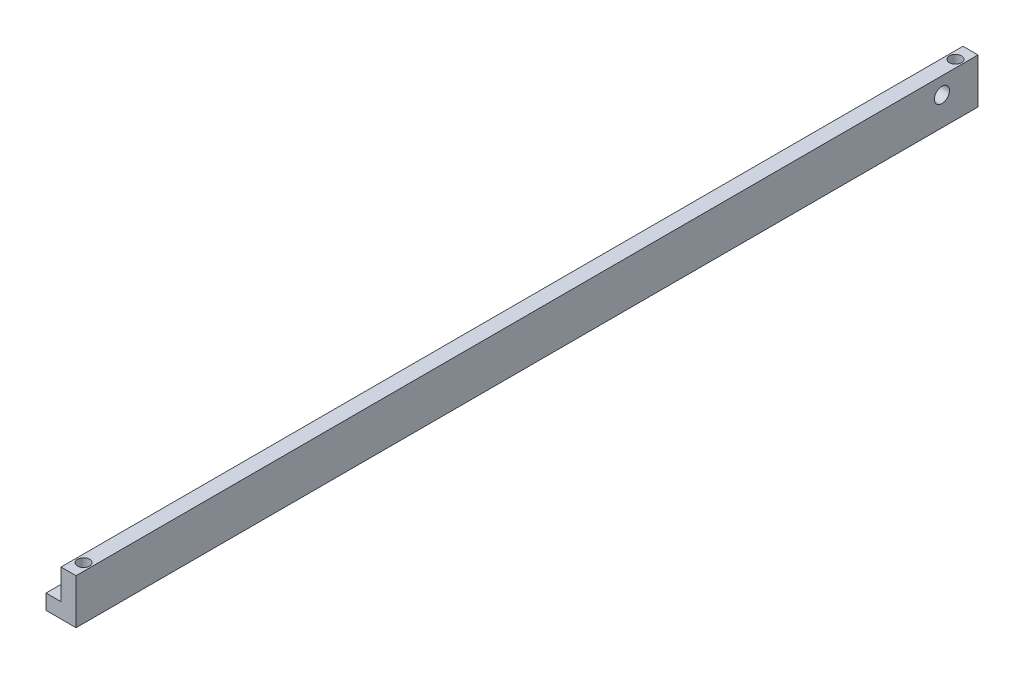
ISO-10303-21;
HEADER;
FILE_DESCRIPTION(('STEP AP214'),'2;1');
FILE_NAME('part.step','',(''),(''),'','','');
FILE_SCHEMA(('AUTOMOTIVE_DESIGN { 1 0 10303 214 1 1 1 1 }'));
ENDSEC;
DATA;
#1=APPLICATION_CONTEXT('core data for automotive mechanical design processes');
#2=APPLICATION_PROTOCOL_DEFINITION('international standard','automotive_design',2000,#1);
#3=PRODUCT_CONTEXT('',#1,'mechanical');
#4=PRODUCT('Part','Part','',(#3));
#5=PRODUCT_RELATED_PRODUCT_CATEGORY('part','',(#4));
#6=PRODUCT_DEFINITION_FORMATION('','',#4);
#7=PRODUCT_DEFINITION_CONTEXT('part definition',#1,'design');
#8=PRODUCT_DEFINITION('design','',#6,#7);
#9=PRODUCT_DEFINITION_SHAPE('','',#8);
#10=(LENGTH_UNIT() NAMED_UNIT(*) SI_UNIT(.MILLI.,.METRE.));
#11=(NAMED_UNIT(*) PLANE_ANGLE_UNIT() SI_UNIT($,.RADIAN.));
#12=(NAMED_UNIT(*) SI_UNIT($,.STERADIAN.) SOLID_ANGLE_UNIT());
#13=UNCERTAINTY_MEASURE_WITH_UNIT(LENGTH_MEASURE(1.E-05),#10,'distance_accuracy_value','');
#14=(GEOMETRIC_REPRESENTATION_CONTEXT(3) GLOBAL_UNCERTAINTY_ASSIGNED_CONTEXT((#13)) GLOBAL_UNIT_ASSIGNED_CONTEXT((#10,
#11,#12)) REPRESENTATION_CONTEXT('',''));
#15=CARTESIAN_POINT('',(0.,0.,0.));
#16=DIRECTION('',(0.,0.,1.));
#17=DIRECTION('',(1.,0.,0.));
#18=AXIS2_PLACEMENT_3D('',#15,#16,#17);
#19=CARTESIAN_POINT('',(-6.35,0.,381.));
#20=DIRECTION('',(-1.,0.,0.));
#21=DIRECTION('',(0.,0.,1.));
#22=AXIS2_PLACEMENT_3D('',#19,#20,#21);
#23=PLANE('',#22);
#24=CARTESIAN_POINT('',(-6.35,12.065,15.24));
#25=DIRECTION('',(-1.,0.,0.));
#26=DIRECTION('',(0.,0.,1.));
#27=AXIS2_PLACEMENT_3D('',#24,#25,#26);
#28=CIRCLE('',#27,3.1750001016);
#29=CARTESIAN_POINT('',(-6.35,12.065,18.4150001016));
#30=VERTEX_POINT('',#29);
#31=EDGE_CURVE('E48',#30,#30,#28,.T.);
#32=ORIENTED_EDGE('',*,*,#31,.F.);
#33=EDGE_LOOP('',(#32));
#34=FACE_BOUND('',#33,.T.);
#35=DIRECTION('',(0.,0.,-1.));
#36=VECTOR('',#35,1.);
#37=CARTESIAN_POINT('',(-6.35,0.,381.));
#38=LINE('',#37,#36);
#39=CARTESIAN_POINT('',(-6.35,0.,345.44));
#40=VERTEX_POINT('',#39);
#41=CARTESIAN_POINT('',(-6.35,0.,0.));
#42=VERTEX_POINT('',#41);
#43=EDGE_CURVE('E129',#40,#42,#38,.T.);
#44=ORIENTED_EDGE('',*,*,#43,.F.);
#45=DIRECTION('',(0.,1.,0.));
#46=VECTOR('',#45,1.);
#47=CARTESIAN_POINT('',(-6.35,0.,345.44));
#48=LINE('',#47,#46);
#49=CARTESIAN_POINT('',(-6.35,6.35,345.44));
#50=VERTEX_POINT('',#49);
#51=EDGE_CURVE('E121',#40,#50,#48,.T.);
#52=ORIENTED_EDGE('',*,*,#51,.T.);
#53=DIRECTION('',(0.,0.,1.));
#54=VECTOR('',#53,1.);
#55=CARTESIAN_POINT('',(-6.35,6.35,345.44));
#56=LINE('',#55,#54);
#57=CARTESIAN_POINT('',(-6.35,6.35,381.));
#58=VERTEX_POINT('',#57);
#59=EDGE_CURVE('E106',#50,#58,#56,.T.);
#60=ORIENTED_EDGE('',*,*,#59,.T.);
#61=DIRECTION('',(0.,1.,0.));
#62=VECTOR('',#61,1.);
#63=CARTESIAN_POINT('',(-6.35,0.,381.));
#64=LINE('',#63,#62);
#65=CARTESIAN_POINT('',(-6.35,19.05,381.));
#66=VERTEX_POINT('',#65);
#67=EDGE_CURVE('E165',#58,#66,#64,.T.);
#68=ORIENTED_EDGE('',*,*,#67,.T.);
#69=DIRECTION('',(0.,0.,-1.));
#70=VECTOR('',#69,1.);
#71=CARTESIAN_POINT('',(-6.35,19.05,381.));
#72=LINE('',#71,#70);
#73=CARTESIAN_POINT('',(-6.35,19.05,0.));
#74=VERTEX_POINT('',#73);
#75=EDGE_CURVE('E54',#66,#74,#72,.T.);
#76=ORIENTED_EDGE('',*,*,#75,.T.);
#77=DIRECTION('',(0.,1.,0.));
#78=VECTOR('',#77,1.);
#79=CARTESIAN_POINT('',(-6.35,0.,0.));
#80=LINE('',#79,#78);
#81=EDGE_CURVE('E178',#42,#74,#80,.T.);
#82=ORIENTED_EDGE('',*,*,#81,.F.);
#83=EDGE_LOOP('',(#44,#52,#60,#68,#76,#82));
#84=FACE_BOUND('',#83,.T.);
#85=ADVANCED_FACE('F44',(#34,#84),#23,.T.);
#86=CARTESIAN_POINT('',(0.,0.,381.));
#87=DIRECTION('',(1.,0.,0.));
#88=DIRECTION('',(0.,1.,0.));
#89=AXIS2_PLACEMENT_3D('',#86,#87,#88);
#90=PLANE('',#89);
#91=CARTESIAN_POINT('',(0.,12.065,15.24));
#92=DIRECTION('',(1.,0.,0.));
#93=DIRECTION('',(0.,0.,-1.));
#94=AXIS2_PLACEMENT_3D('',#91,#92,#93);
#95=CIRCLE('',#94,3.1750001016);
#96=CARTESIAN_POINT('',(0.,12.065,12.0649998984));
#97=VERTEX_POINT('',#96);
#98=EDGE_CURVE('E151',#97,#97,#95,.T.);
#99=ORIENTED_EDGE('',*,*,#98,.F.);
#100=EDGE_LOOP('',(#99));
#101=FACE_BOUND('',#100,.T.);
#102=DIRECTION('',(0.,0.,-1.));
#103=VECTOR('',#102,1.);
#104=CARTESIAN_POINT('',(0.,0.,381.));
#105=LINE('',#104,#103);
#106=CARTESIAN_POINT('',(0.,0.,381.));
#107=VERTEX_POINT('',#106);
#108=CARTESIAN_POINT('',(0.,0.,0.));
#109=VERTEX_POINT('',#108);
#110=EDGE_CURVE('E70',#107,#109,#105,.T.);
#111=ORIENTED_EDGE('',*,*,#110,.T.);
#112=DIRECTION('',(0.,-1.,0.));
#113=VECTOR('',#112,1.);
#114=CARTESIAN_POINT('',(0.,0.,0.));
#115=LINE('',#114,#113);
#116=CARTESIAN_POINT('',(0.,19.05,0.));
#117=VERTEX_POINT('',#116);
#118=EDGE_CURVE('E171',#117,#109,#115,.T.);
#119=ORIENTED_EDGE('',*,*,#118,.F.);
#120=DIRECTION('',(0.,0.,-1.));
#121=VECTOR('',#120,1.);
#122=CARTESIAN_POINT('',(0.,19.05,381.));
#123=LINE('',#122,#121);
#124=CARTESIAN_POINT('',(0.,19.05,381.));
#125=VERTEX_POINT('',#124);
#126=EDGE_CURVE('E11',#125,#117,#123,.T.);
#127=ORIENTED_EDGE('',*,*,#126,.F.);
#128=DIRECTION('',(0.,-1.,0.));
#129=VECTOR('',#128,1.);
#130=CARTESIAN_POINT('',(0.,0.,381.));
#131=LINE('',#130,#129);
#132=EDGE_CURVE('E157',#125,#107,#131,.T.);
#133=ORIENTED_EDGE('',*,*,#132,.T.);
#134=EDGE_LOOP('',(#111,#119,#127,#133));
#135=FACE_BOUND('',#134,.T.);
#136=ADVANCED_FACE('F46',(#101,#135),#90,.T.);
#137=CARTESIAN_POINT('',(0.,19.05,381.));
#138=DIRECTION('',(0.,1.,0.));
#139=DIRECTION('',(0.,0.,1.));
#140=AXIS2_PLACEMENT_3D('',#137,#138,#139);
#141=PLANE('',#140);
#142=CARTESIAN_POINT('',(-3.17499999999995,19.05,374.65));
#143=DIRECTION('',(0.,1.,0.));
#144=DIRECTION('',(0.,0.,1.));
#145=AXIS2_PLACEMENT_3D('',#142,#143,#144);
#146=CIRCLE('',#145,2.54000000000001);
#147=CARTESIAN_POINT('',(-3.17499999999995,19.05,377.19));
#148=VERTEX_POINT('',#147);
#149=EDGE_CURVE('E256',#148,#148,#146,.T.);
#150=ORIENTED_EDGE('',*,*,#149,.F.);
#151=EDGE_LOOP('',(#150));
#152=FACE_BOUND('',#151,.T.);
#153=CARTESIAN_POINT('',(-3.175,19.05,6.35));
#154=DIRECTION('',(0.,1.,0.));
#155=DIRECTION('',(0.,0.,1.));
#156=AXIS2_PLACEMENT_3D('',#153,#154,#155);
#157=CIRCLE('',#156,2.54);
#158=CARTESIAN_POINT('',(-3.175,19.05,8.89));
#159=VERTEX_POINT('',#158);
#160=EDGE_CURVE('E259',#159,#159,#157,.T.);
#161=ORIENTED_EDGE('',*,*,#160,.F.);
#162=EDGE_LOOP('',(#161));
#163=FACE_BOUND('',#162,.T.);
#164=ORIENTED_EDGE('',*,*,#126,.T.);
#165=DIRECTION('',(1.,0.,0.));
#166=VECTOR('',#165,1.);
#167=CARTESIAN_POINT('',(0.,19.05,0.));
#168=LINE('',#167,#166);
#169=EDGE_CURVE('E174',#74,#117,#168,.T.);
#170=ORIENTED_EDGE('',*,*,#169,.F.);
#171=ORIENTED_EDGE('',*,*,#75,.F.);
#172=DIRECTION('',(1.,0.,0.));
#173=VECTOR('',#172,1.);
#174=CARTESIAN_POINT('',(0.,19.05,381.));
#175=LINE('',#174,#173);
#176=EDGE_CURVE('E160',#66,#125,#175,.T.);
#177=ORIENTED_EDGE('',*,*,#176,.T.);
#178=EDGE_LOOP('',(#164,#170,#171,#177));
#179=FACE_BOUND('',#178,.T.);
#180=ADVANCED_FACE('F194',(#152,#163,#179),#141,.T.);
#181=CARTESIAN_POINT('',(0.,0.,381.));
#182=DIRECTION('',(0.,-1.,0.));
#183=DIRECTION('',(1.,0.,0.));
#184=AXIS2_PLACEMENT_3D('',#181,#182,#183);
#185=PLANE('',#184);
#186=CARTESIAN_POINT('',(-3.175,0.,374.65));
#187=DIRECTION('',(0.,-1.,0.));
#188=DIRECTION('',(1.,0.,0.));
#189=AXIS2_PLACEMENT_3D('',#186,#187,#188);
#190=CIRCLE('',#189,2.54000000000001);
#191=CARTESIAN_POINT('',(-0.634999999999995,0.,374.65));
#192=VERTEX_POINT('',#191);
#193=EDGE_CURVE('E237',#192,#192,#190,.T.);
#194=ORIENTED_EDGE('',*,*,#193,.F.);
#195=EDGE_LOOP('',(#194));
#196=FACE_BOUND('',#195,.T.);
#197=CARTESIAN_POINT('',(-3.175,0.,6.35));
#198=DIRECTION('',(0.,-1.,0.));
#199=DIRECTION('',(1.,0.,0.));
#200=AXIS2_PLACEMENT_3D('',#197,#198,#199);
#201=CIRCLE('',#200,2.54);
#202=CARTESIAN_POINT('',(-0.635,0.,6.35));
#203=VERTEX_POINT('',#202);
#204=EDGE_CURVE('E240',#203,#203,#201,.T.);
#205=ORIENTED_EDGE('',*,*,#204,.F.);
#206=EDGE_LOOP('',(#205));
#207=FACE_BOUND('',#206,.T.);
#208=DIRECTION('',(-1.,0.,0.));
#209=VECTOR('',#208,1.);
#210=CARTESIAN_POINT('',(0.,0.,381.));
#211=LINE('',#210,#209);
#212=CARTESIAN_POINT('',(-12.7,0.,381.));
#213=VERTEX_POINT('',#212);
#214=EDGE_CURVE('E168',#107,#213,#211,.T.);
#215=ORIENTED_EDGE('',*,*,#214,.T.);
#216=DIRECTION('',(0.,0.,1.));
#217=VECTOR('',#216,1.);
#218=CARTESIAN_POINT('',(-12.7,0.,345.44));
#219=LINE('',#218,#217);
#220=CARTESIAN_POINT('',(-12.7,0.,345.44));
#221=VERTEX_POINT('',#220);
#222=EDGE_CURVE('E147',#221,#213,#219,.T.);
#223=ORIENTED_EDGE('',*,*,#222,.F.);
#224=DIRECTION('',(1.,0.,0.));
#225=VECTOR('',#224,1.);
#226=CARTESIAN_POINT('',(-6.35,0.,345.44));
#227=LINE('',#226,#225);
#228=EDGE_CURVE('E115',#221,#40,#227,.T.);
#229=ORIENTED_EDGE('',*,*,#228,.T.);
#230=ORIENTED_EDGE('',*,*,#43,.T.);
#231=DIRECTION('',(-1.,0.,0.));
#232=VECTOR('',#231,1.);
#233=CARTESIAN_POINT('',(0.,0.,0.));
#234=LINE('',#233,#232);
#235=EDGE_CURVE('E161',#109,#42,#234,.T.);
#236=ORIENTED_EDGE('',*,*,#235,.F.);
#237=ORIENTED_EDGE('',*,*,#110,.F.);
#238=EDGE_LOOP('',(#215,#223,#229,#230,#236,#237));
#239=FACE_BOUND('',#238,.T.);
#240=ADVANCED_FACE('F197',(#196,#207,#239),#185,.T.);
#241=CARTESIAN_POINT('',(0.,0.,381.));
#242=DIRECTION('',(0.,0.,1.));
#243=DIRECTION('',(1.,0.,0.));
#244=AXIS2_PLACEMENT_3D('',#241,#242,#243);
#245=PLANE('',#244);
#246=ORIENTED_EDGE('',*,*,#132,.F.);
#247=ORIENTED_EDGE('',*,*,#176,.F.);
#248=ORIENTED_EDGE('',*,*,#67,.F.);
#249=DIRECTION('',(-1.,0.,0.));
#250=VECTOR('',#249,1.);
#251=CARTESIAN_POINT('',(-6.35,6.35,381.));
#252=LINE('',#251,#250);
#253=CARTESIAN_POINT('',(-12.7,6.35,381.));
#254=VERTEX_POINT('',#253);
#255=EDGE_CURVE('E61',#58,#254,#252,.T.);
#256=ORIENTED_EDGE('',*,*,#255,.T.);
#257=DIRECTION('',(0.,-1.,0.));
#258=VECTOR('',#257,1.);
#259=CARTESIAN_POINT('',(-12.7,0.,381.));
#260=LINE('',#259,#258);
#261=EDGE_CURVE('E131',#254,#213,#260,.T.);
#262=ORIENTED_EDGE('',*,*,#261,.T.);
#263=ORIENTED_EDGE('',*,*,#214,.F.);
#264=EDGE_LOOP('',(#246,#247,#248,#256,#262,#263));
#265=FACE_BOUND('',#264,.T.);
#266=ADVANCED_FACE('F203',(#265),#245,.T.);
#267=CARTESIAN_POINT('',(0.,0.,0.));
#268=DIRECTION('',(0.,0.,1.));
#269=DIRECTION('',(1.,0.,0.));
#270=AXIS2_PLACEMENT_3D('',#267,#268,#269);
#271=PLANE('',#270);
#272=ORIENTED_EDGE('',*,*,#118,.T.);
#273=ORIENTED_EDGE('',*,*,#235,.T.);
#274=ORIENTED_EDGE('',*,*,#81,.T.);
#275=ORIENTED_EDGE('',*,*,#169,.T.);
#276=EDGE_LOOP('',(#272,#273,#274,#275));
#277=FACE_BOUND('',#276,.T.);
#278=ADVANCED_FACE('F196',(#277),#271,.F.);
#279=CARTESIAN_POINT('',(-25.4,12.065,15.24));
#280=DIRECTION('',(1.,0.,0.));
#281=DIRECTION('',(0.,0.,-1.));
#282=AXIS2_PLACEMENT_3D('',#279,#280,#281);
#283=CYLINDRICAL_SURFACE('',#282,3.1750001016);
#284=ORIENTED_EDGE('',*,*,#31,.T.);
#285=EDGE_LOOP('',(#284));
#286=FACE_BOUND('',#285,.T.);
#287=ORIENTED_EDGE('',*,*,#98,.T.);
#288=EDGE_LOOP('',(#287));
#289=FACE_BOUND('',#288,.T.);
#290=ADVANCED_FACE('F215',(#286,#289),#283,.F.);
#291=CARTESIAN_POINT('',(-12.7,0.,345.44));
#292=DIRECTION('',(-1.,0.,0.));
#293=DIRECTION('',(0.,0.,1.));
#294=AXIS2_PLACEMENT_3D('',#291,#292,#293);
#295=PLANE('',#294);
#296=ORIENTED_EDGE('',*,*,#261,.F.);
#297=DIRECTION('',(0.,0.,1.));
#298=VECTOR('',#297,1.);
#299=CARTESIAN_POINT('',(-12.7,6.35,345.44));
#300=LINE('',#299,#298);
#301=CARTESIAN_POINT('',(-12.7,6.35,345.44));
#302=VERTEX_POINT('',#301);
#303=EDGE_CURVE('E114',#302,#254,#300,.T.);
#304=ORIENTED_EDGE('',*,*,#303,.F.);
#305=DIRECTION('',(0.,-1.,0.));
#306=VECTOR('',#305,1.);
#307=CARTESIAN_POINT('',(-12.7,0.,345.44));
#308=LINE('',#307,#306);
#309=EDGE_CURVE('E124',#302,#221,#308,.T.);
#310=ORIENTED_EDGE('',*,*,#309,.T.);
#311=ORIENTED_EDGE('',*,*,#222,.T.);
#312=EDGE_LOOP('',(#296,#304,#310,#311));
#313=FACE_BOUND('',#312,.T.);
#314=ADVANCED_FACE('F201',(#313),#295,.T.);
#315=CARTESIAN_POINT('',(-6.35,6.35,345.44));
#316=DIRECTION('',(0.,1.,0.));
#317=DIRECTION('',(-1.,0.,0.));
#318=AXIS2_PLACEMENT_3D('',#315,#316,#317);
#319=PLANE('',#318);
#320=ORIENTED_EDGE('',*,*,#255,.F.);
#321=ORIENTED_EDGE('',*,*,#59,.F.);
#322=DIRECTION('',(-1.,0.,0.));
#323=VECTOR('',#322,1.);
#324=CARTESIAN_POINT('',(-6.35,6.35,345.44));
#325=LINE('',#324,#323);
#326=EDGE_CURVE('E109',#50,#302,#325,.T.);
#327=ORIENTED_EDGE('',*,*,#326,.T.);
#328=ORIENTED_EDGE('',*,*,#303,.T.);
#329=EDGE_LOOP('',(#320,#321,#327,#328));
#330=FACE_BOUND('',#329,.T.);
#331=ADVANCED_FACE('F108',(#330),#319,.T.);
#332=CARTESIAN_POINT('',(0.,0.,345.44));
#333=DIRECTION('',(0.,0.,1.));
#334=DIRECTION('',(1.,0.,0.));
#335=AXIS2_PLACEMENT_3D('',#332,#333,#334);
#336=PLANE('',#335);
#337=ORIENTED_EDGE('',*,*,#51,.F.);
#338=ORIENTED_EDGE('',*,*,#228,.F.);
#339=ORIENTED_EDGE('',*,*,#309,.F.);
#340=ORIENTED_EDGE('',*,*,#326,.F.);
#341=EDGE_LOOP('',(#337,#338,#339,#340));
#342=FACE_BOUND('',#341,.T.);
#343=ADVANCED_FACE('F119',(#342),#336,.F.);
#344=CARTESIAN_POINT('',(-3.175,11.43,6.35));
#345=DIRECTION('',(0.,1.,0.));
#346=DIRECTION('',(0.,0.,1.));
#347=AXIS2_PLACEMENT_3D('',#344,#345,#346);
#348=CYLINDRICAL_SURFACE('',#347,2.54);
#349=CARTESIAN_POINT('',(-3.175,11.43,6.35));
#350=DIRECTION('',(0.,1.,0.));
#351=DIRECTION('',(0.,0.,1.));
#352=AXIS2_PLACEMENT_3D('',#349,#350,#351);
#353=CIRCLE('',#352,2.54);
#354=CARTESIAN_POINT('',(-3.175,11.43,8.89));
#355=VERTEX_POINT('',#354);
#356=EDGE_CURVE('E137',#355,#355,#353,.T.);
#357=CARTESIAN_POINT('',(-3.175,11.43,8.89));
#358=CARTESIAN_POINT('',(-3.175,11.509375,8.89));
#359=CARTESIAN_POINT('',(-3.175,11.58875,8.89));
#360=CARTESIAN_POINT('',(-3.175,11.7475,8.89));
#361=CARTESIAN_POINT('',(-3.175,11.826875,8.89));
#362=CARTESIAN_POINT('',(-3.175,11.985625,8.89));
#363=CARTESIAN_POINT('',(-3.175,12.065,8.89));
#364=CARTESIAN_POINT('',(-3.175,12.22375,8.89));
#365=CARTESIAN_POINT('',(-3.175,12.303125,8.89));
#366=CARTESIAN_POINT('',(-3.175,12.461875,8.89));
#367=CARTESIAN_POINT('',(-3.175,12.54125,8.89));
#368=CARTESIAN_POINT('',(-3.175,12.7,8.89));
#369=CARTESIAN_POINT('',(-3.175,12.779375,8.89));
#370=CARTESIAN_POINT('',(-3.175,12.938125,8.89));
#371=CARTESIAN_POINT('',(-3.175,13.0175,8.89));
#372=CARTESIAN_POINT('',(-3.175,13.17625,8.89));
#373=CARTESIAN_POINT('',(-3.175,13.255625,8.89));
#374=CARTESIAN_POINT('',(-3.175,13.414375,8.89));
#375=CARTESIAN_POINT('',(-3.175,13.49375,8.89));
#376=CARTESIAN_POINT('',(-3.175,13.6525,8.89));
#377=CARTESIAN_POINT('',(-3.175,13.731875,8.89));
#378=CARTESIAN_POINT('',(-3.175,13.890625,8.89));
#379=CARTESIAN_POINT('',(-3.175,13.97,8.89));
#380=CARTESIAN_POINT('',(-3.175,14.12875,8.89));
#381=CARTESIAN_POINT('',(-3.175,14.208125,8.89));
#382=CARTESIAN_POINT('',(-3.175,14.366875,8.89));
#383=CARTESIAN_POINT('',(-3.175,14.44625,8.89));
#384=CARTESIAN_POINT('',(-3.175,14.605,8.89));
#385=CARTESIAN_POINT('',(-3.175,14.684375,8.89));
#386=CARTESIAN_POINT('',(-3.175,14.843125,8.89));
#387=CARTESIAN_POINT('',(-3.175,14.9225,8.89));
#388=CARTESIAN_POINT('',(-3.175,15.08125,8.89));
#389=CARTESIAN_POINT('',(-3.175,15.160625,8.89));
#390=CARTESIAN_POINT('',(-3.175,15.319375,8.89));
#391=CARTESIAN_POINT('',(-3.175,15.39875,8.89));
#392=CARTESIAN_POINT('',(-3.175,15.5575,8.89));
#393=CARTESIAN_POINT('',(-3.175,15.636875,8.89));
#394=CARTESIAN_POINT('',(-3.175,15.795625,8.89));
#395=CARTESIAN_POINT('',(-3.175,15.875,8.89));
#396=CARTESIAN_POINT('',(-3.175,16.03375,8.89));
#397=CARTESIAN_POINT('',(-3.175,16.113125,8.89));
#398=CARTESIAN_POINT('',(-3.175,16.271875,8.89));
#399=CARTESIAN_POINT('',(-3.175,16.35125,8.89));
#400=CARTESIAN_POINT('',(-3.175,16.51,8.89));
#401=CARTESIAN_POINT('',(-3.175,16.589375,8.89));
#402=CARTESIAN_POINT('',(-3.175,16.748125,8.89));
#403=CARTESIAN_POINT('',(-3.175,16.8275,8.89));
#404=CARTESIAN_POINT('',(-3.175,16.98625,8.89));
#405=CARTESIAN_POINT('',(-3.175,17.065625,8.89));
#406=CARTESIAN_POINT('',(-3.175,17.224375,8.89));
#407=CARTESIAN_POINT('',(-3.175,17.30375,8.89));
#408=CARTESIAN_POINT('',(-3.175,17.4625,8.89));
#409=CARTESIAN_POINT('',(-3.175,17.541875,8.89));
#410=CARTESIAN_POINT('',(-3.175,17.700625,8.89));
#411=CARTESIAN_POINT('',(-3.175,17.78,8.89));
#412=CARTESIAN_POINT('',(-3.175,17.93875,8.89));
#413=CARTESIAN_POINT('',(-3.175,18.018125,8.89));
#414=CARTESIAN_POINT('',(-3.175,18.176875,8.89));
#415=CARTESIAN_POINT('',(-3.175,18.25625,8.89));
#416=CARTESIAN_POINT('',(-3.175,18.415,8.89));
#417=CARTESIAN_POINT('',(-3.175,18.494375,8.89));
#418=CARTESIAN_POINT('',(-3.175,18.653125,8.89));
#419=CARTESIAN_POINT('',(-3.175,18.7325,8.89));
#420=CARTESIAN_POINT('',(-3.175,18.89125,8.89));
#421=CARTESIAN_POINT('',(-3.175,18.970625,8.89));
#422=CARTESIAN_POINT('',(-3.175,19.05,8.89));
#423=B_SPLINE_CURVE_WITH_KNOTS('',3,(#357,#358,#359,#360,#361,#362,#363,#364,#365,#366,#367,
#368,#369,#370,#371,#372,#373,#374,#375,#376,#377,#378,#379,#380,#381,#382,#383,#384,#385,#386,
#387,#388,#389,#390,#391,#392,#393,#394,#395,#396,#397,#398,#399,#400,#401,#402,#403,#404,#405,
#406,#407,#408,#409,#410,#411,#412,#413,#414,#415,#416,#417,#418,#419,#420,#421,#422),
.UNSPECIFIED.,.F.,.F.,(4,2,2,2,2,2,2,2,2,2,2,2,2,2,2,2,2,2,2,2,2,2,2,2,2,2,2,2,2,2,2,2,4),(0.,
0.238125,0.476250000000001,0.714375000000001,0.9525,1.190625,1.42875,1.666875,1.905,2.143125,
2.38125,2.619375,2.8575,3.095625,3.33375,3.571875,3.81,4.048125,4.28625,4.524375,4.7625,
5.000625,5.23875,5.476875,5.715,5.953125,6.19125,6.429375,6.6675,6.905625,7.14375,7.381875,
7.62),.UNSPECIFIED.);
#424=EDGE_CURVE('BSEAM300',#355,#159,#423,.T.);
#425=ORIENTED_EDGE('',*,*,#356,.F.);
#426=ORIENTED_EDGE('',*,*,#160,.T.);
#427=ORIENTED_EDGE('',*,*,#424,.T.);
#428=ORIENTED_EDGE('',*,*,#424,.F.);
#429=EDGE_LOOP('',(#425,#427,#426,#428));
#430=FACE_BOUND('',#429,.T.);
#431=ADVANCED_FACE('F300',(#430),#348,.F.);
#432=CARTESIAN_POINT('',(-3.175,11.43,6.35));
#433=DIRECTION('',(0.,1.,0.));
#434=DIRECTION('',(0.,0.,1.));
#435=AXIS2_PLACEMENT_3D('',#432,#433,#434);
#436=PLANE('',#435);
#437=ORIENTED_EDGE('',*,*,#356,.T.);
#438=EDGE_LOOP('',(#437));
#439=FACE_BOUND('',#438,.T.);
#440=ADVANCED_FACE('F298',(#439),#436,.T.);
#441=CARTESIAN_POINT('',(-3.17499999999995,11.43,374.65));
#442=DIRECTION('',(0.,1.,0.));
#443=DIRECTION('',(0.,0.,1.));
#444=AXIS2_PLACEMENT_3D('',#441,#442,#443);
#445=CYLINDRICAL_SURFACE('',#444,2.54000000000001);
#446=CARTESIAN_POINT('',(-3.17499999999995,11.43,374.65));
#447=DIRECTION('',(0.,1.,0.));
#448=DIRECTION('',(0.,0.,1.));
#449=AXIS2_PLACEMENT_3D('',#446,#447,#448);
#450=CIRCLE('',#449,2.54000000000001);
#451=CARTESIAN_POINT('',(-3.17499999999995,11.43,377.19));
#452=VERTEX_POINT('',#451);
#453=EDGE_CURVE('E145',#452,#452,#450,.T.);
#454=CARTESIAN_POINT('',(-3.17499999999995,11.43,377.19));
#455=CARTESIAN_POINT('',(-3.17499999999995,11.509375,377.19));
#456=CARTESIAN_POINT('',(-3.17499999999995,11.58875,377.19));
#457=CARTESIAN_POINT('',(-3.17499999999995,11.7475,377.19));
#458=CARTESIAN_POINT('',(-3.17499999999995,11.826875,377.19));
#459=CARTESIAN_POINT('',(-3.17499999999995,11.985625,377.19));
#460=CARTESIAN_POINT('',(-3.17499999999995,12.065,377.19));
#461=CARTESIAN_POINT('',(-3.17499999999995,12.22375,377.19));
#462=CARTESIAN_POINT('',(-3.17499999999995,12.303125,377.19));
#463=CARTESIAN_POINT('',(-3.17499999999995,12.461875,377.19));
#464=CARTESIAN_POINT('',(-3.17499999999995,12.54125,377.19));
#465=CARTESIAN_POINT('',(-3.17499999999995,12.7,377.19));
#466=CARTESIAN_POINT('',(-3.17499999999995,12.779375,377.19));
#467=CARTESIAN_POINT('',(-3.17499999999995,12.938125,377.19));
#468=CARTESIAN_POINT('',(-3.17499999999995,13.0175,377.19));
#469=CARTESIAN_POINT('',(-3.17499999999995,13.17625,377.19));
#470=CARTESIAN_POINT('',(-3.17499999999995,13.255625,377.19));
#471=CARTESIAN_POINT('',(-3.17499999999995,13.414375,377.19));
#472=CARTESIAN_POINT('',(-3.17499999999995,13.49375,377.19));
#473=CARTESIAN_POINT('',(-3.17499999999995,13.6525,377.19));
#474=CARTESIAN_POINT('',(-3.17499999999995,13.731875,377.19));
#475=CARTESIAN_POINT('',(-3.17499999999995,13.890625,377.19));
#476=CARTESIAN_POINT('',(-3.17499999999995,13.97,377.19));
#477=CARTESIAN_POINT('',(-3.17499999999995,14.12875,377.19));
#478=CARTESIAN_POINT('',(-3.17499999999995,14.208125,377.19));
#479=CARTESIAN_POINT('',(-3.17499999999995,14.366875,377.19));
#480=CARTESIAN_POINT('',(-3.17499999999995,14.44625,377.19));
#481=CARTESIAN_POINT('',(-3.17499999999995,14.605,377.19));
#482=CARTESIAN_POINT('',(-3.17499999999995,14.684375,377.19));
#483=CARTESIAN_POINT('',(-3.17499999999995,14.843125,377.19));
#484=CARTESIAN_POINT('',(-3.17499999999995,14.9225,377.19));
#485=CARTESIAN_POINT('',(-3.17499999999995,15.08125,377.19));
#486=CARTESIAN_POINT('',(-3.17499999999995,15.160625,377.19));
#487=CARTESIAN_POINT('',(-3.17499999999995,15.319375,377.19));
#488=CARTESIAN_POINT('',(-3.17499999999995,15.39875,377.19));
#489=CARTESIAN_POINT('',(-3.17499999999995,15.5575,377.19));
#490=CARTESIAN_POINT('',(-3.17499999999995,15.636875,377.19));
#491=CARTESIAN_POINT('',(-3.17499999999995,15.795625,377.19));
#492=CARTESIAN_POINT('',(-3.17499999999995,15.875,377.19));
#493=CARTESIAN_POINT('',(-3.17499999999995,16.03375,377.19));
#494=CARTESIAN_POINT('',(-3.17499999999995,16.113125,377.19));
#495=CARTESIAN_POINT('',(-3.17499999999995,16.271875,377.19));
#496=CARTESIAN_POINT('',(-3.17499999999995,16.35125,377.19));
#497=CARTESIAN_POINT('',(-3.17499999999995,16.51,377.19));
#498=CARTESIAN_POINT('',(-3.17499999999995,16.589375,377.19));
#499=CARTESIAN_POINT('',(-3.17499999999995,16.748125,377.19));
#500=CARTESIAN_POINT('',(-3.17499999999995,16.8275,377.19));
#501=CARTESIAN_POINT('',(-3.17499999999995,16.98625,377.19));
#502=CARTESIAN_POINT('',(-3.17499999999995,17.065625,377.19));
#503=CARTESIAN_POINT('',(-3.17499999999995,17.224375,377.19));
#504=CARTESIAN_POINT('',(-3.17499999999995,17.30375,377.19));
#505=CARTESIAN_POINT('',(-3.17499999999995,17.4625,377.19));
#506=CARTESIAN_POINT('',(-3.17499999999995,17.541875,377.19));
#507=CARTESIAN_POINT('',(-3.17499999999995,17.700625,377.19));
#508=CARTESIAN_POINT('',(-3.17499999999995,17.78,377.19));
#509=CARTESIAN_POINT('',(-3.17499999999995,17.93875,377.19));
#510=CARTESIAN_POINT('',(-3.17499999999995,18.018125,377.19));
#511=CARTESIAN_POINT('',(-3.17499999999995,18.176875,377.19));
#512=CARTESIAN_POINT('',(-3.17499999999995,18.25625,377.19));
#513=CARTESIAN_POINT('',(-3.17499999999995,18.415,377.19));
#514=CARTESIAN_POINT('',(-3.17499999999995,18.494375,377.19));
#515=CARTESIAN_POINT('',(-3.17499999999995,18.653125,377.19));
#516=CARTESIAN_POINT('',(-3.17499999999995,18.7325,377.19));
#517=CARTESIAN_POINT('',(-3.17499999999995,18.89125,377.19));
#518=CARTESIAN_POINT('',(-3.17499999999995,18.970625,377.19));
#519=CARTESIAN_POINT('',(-3.17499999999995,19.05,377.19));
#520=B_SPLINE_CURVE_WITH_KNOTS('',3,(#454,#455,#456,#457,#458,#459,#460,#461,#462,#463,#464,
#465,#466,#467,#468,#469,#470,#471,#472,#473,#474,#475,#476,#477,#478,#479,#480,#481,#482,#483,
#484,#485,#486,#487,#488,#489,#490,#491,#492,#493,#494,#495,#496,#497,#498,#499,#500,#501,#502,
#503,#504,#505,#506,#507,#508,#509,#510,#511,#512,#513,#514,#515,#516,#517,#518,#519),
.UNSPECIFIED.,.F.,.F.,(4,2,2,2,2,2,2,2,2,2,2,2,2,2,2,2,2,2,2,2,2,2,2,2,2,2,2,2,2,2,2,2,4),(0.,
0.238125,0.476250000000001,0.714375000000001,0.9525,1.190625,1.42875,1.666875,1.905,2.143125,
2.38125,2.619375,2.8575,3.095625,3.33375,3.571875,3.81,4.048125,4.28625,4.524375,4.7625,
5.000625,5.23875,5.476875,5.715,5.953125,6.19125,6.429375,6.6675,6.905625,7.14375,7.381875,
7.62),.UNSPECIFIED.);
#521=EDGE_CURVE('BSEAM294',#452,#148,#520,.T.);
#522=ORIENTED_EDGE('',*,*,#453,.F.);
#523=ORIENTED_EDGE('',*,*,#149,.T.);
#524=ORIENTED_EDGE('',*,*,#521,.T.);
#525=ORIENTED_EDGE('',*,*,#521,.F.);
#526=EDGE_LOOP('',(#522,#524,#523,#525));
#527=FACE_BOUND('',#526,.T.);
#528=ADVANCED_FACE('F294',(#527),#445,.F.);
#529=CARTESIAN_POINT('',(-3.17499999999995,11.43,374.65));
#530=DIRECTION('',(0.,1.,0.));
#531=DIRECTION('',(0.,0.,1.));
#532=AXIS2_PLACEMENT_3D('',#529,#530,#531);
#533=PLANE('',#532);
#534=ORIENTED_EDGE('',*,*,#453,.T.);
#535=EDGE_LOOP('',(#534));
#536=FACE_BOUND('',#535,.T.);
#537=ADVANCED_FACE('F289',(#536),#533,.T.);
#538=CARTESIAN_POINT('',(-3.175,7.62,6.35));
#539=DIRECTION('',(0.,-1.,0.));
#540=DIRECTION('',(1.,0.,0.));
#541=AXIS2_PLACEMENT_3D('',#538,#539,#540);
#542=CYLINDRICAL_SURFACE('',#541,2.54);
#543=CARTESIAN_POINT('',(-3.175,7.62,6.35));
#544=DIRECTION('',(0.,-1.,0.));
#545=DIRECTION('',(1.,0.,0.));
#546=AXIS2_PLACEMENT_3D('',#543,#544,#545);
#547=CIRCLE('',#546,2.54);
#548=CARTESIAN_POINT('',(-0.635000000000001,7.62,6.35));
#549=VERTEX_POINT('',#548);
#550=EDGE_CURVE('E243',#549,#549,#547,.T.);
#551=CARTESIAN_POINT('',(-0.635000000000001,7.62,6.35));
#552=CARTESIAN_POINT('',(-0.635000000000001,7.540625,6.35));
#553=CARTESIAN_POINT('',(-0.635000000000001,7.46125,6.35));
#554=CARTESIAN_POINT('',(-0.635000000000001,7.3025,6.35));
#555=CARTESIAN_POINT('',(-0.635000000000001,7.223125,6.35));
#556=CARTESIAN_POINT('',(-0.635000000000001,7.064375,6.35));
#557=CARTESIAN_POINT('',(-0.635,6.985,6.35));
#558=CARTESIAN_POINT('',(-0.635,6.82625,6.35));
#559=CARTESIAN_POINT('',(-0.635,6.746875,6.35));
#560=CARTESIAN_POINT('',(-0.635,6.588125,6.35));
#561=CARTESIAN_POINT('',(-0.635,6.50875,6.35));
#562=CARTESIAN_POINT('',(-0.635,6.35,6.35));
#563=CARTESIAN_POINT('',(-0.635,6.270625,6.35));
#564=CARTESIAN_POINT('',(-0.635,6.111875,6.35));
#565=CARTESIAN_POINT('',(-0.635,6.0325,6.35));
#566=CARTESIAN_POINT('',(-0.635,5.87375,6.35));
#567=CARTESIAN_POINT('',(-0.635,5.794375,6.35));
#568=CARTESIAN_POINT('',(-0.635,5.635625,6.35));
#569=CARTESIAN_POINT('',(-0.635,5.55625,6.35));
#570=CARTESIAN_POINT('',(-0.635,5.3975,6.35));
#571=CARTESIAN_POINT('',(-0.635,5.318125,6.35));
#572=CARTESIAN_POINT('',(-0.635,5.159375,6.35));
#573=CARTESIAN_POINT('',(-0.635,5.08,6.35));
#574=CARTESIAN_POINT('',(-0.635,4.92125,6.35));
#575=CARTESIAN_POINT('',(-0.635,4.841875,6.35));
#576=CARTESIAN_POINT('',(-0.635,4.683125,6.35));
#577=CARTESIAN_POINT('',(-0.635,4.60375,6.35));
#578=CARTESIAN_POINT('',(-0.635,4.445,6.35));
#579=CARTESIAN_POINT('',(-0.635,4.365625,6.35));
#580=CARTESIAN_POINT('',(-0.635,4.206875,6.35));
#581=CARTESIAN_POINT('',(-0.635,4.1275,6.35));
#582=CARTESIAN_POINT('',(-0.635,3.96875,6.35));
#583=CARTESIAN_POINT('',(-0.635,3.889375,6.35));
#584=CARTESIAN_POINT('',(-0.635,3.730625,6.35));
#585=CARTESIAN_POINT('',(-0.635,3.65125,6.35));
#586=CARTESIAN_POINT('',(-0.635,3.4925,6.35));
#587=CARTESIAN_POINT('',(-0.635,3.413125,6.35));
#588=CARTESIAN_POINT('',(-0.635,3.254375,6.35));
#589=CARTESIAN_POINT('',(-0.635,3.175,6.35));
#590=CARTESIAN_POINT('',(-0.635,3.01625,6.35));
#591=CARTESIAN_POINT('',(-0.635,2.936875,6.35));
#592=CARTESIAN_POINT('',(-0.635,2.778125,6.35));
#593=CARTESIAN_POINT('',(-0.635,2.69875,6.35));
#594=CARTESIAN_POINT('',(-0.635,2.54,6.35));
#595=CARTESIAN_POINT('',(-0.635,2.460625,6.35));
#596=CARTESIAN_POINT('',(-0.635,2.301875,6.35));
#597=CARTESIAN_POINT('',(-0.635,2.2225,6.35));
#598=CARTESIAN_POINT('',(-0.635,2.06375,6.35));
#599=CARTESIAN_POINT('',(-0.635,1.984375,6.35));
#600=CARTESIAN_POINT('',(-0.635,1.825625,6.35));
#601=CARTESIAN_POINT('',(-0.635,1.74625,6.35));
#602=CARTESIAN_POINT('',(-0.635,1.5875,6.35));
#603=CARTESIAN_POINT('',(-0.635,1.508125,6.35));
#604=CARTESIAN_POINT('',(-0.635,1.349375,6.35));
#605=CARTESIAN_POINT('',(-0.635,1.27,6.35));
#606=CARTESIAN_POINT('',(-0.635,1.11125,6.35));
#607=CARTESIAN_POINT('',(-0.635,1.031875,6.35));
#608=CARTESIAN_POINT('',(-0.635,0.873125,6.35));
#609=CARTESIAN_POINT('',(-0.635,0.79375,6.35));
#610=CARTESIAN_POINT('',(-0.635,0.635,6.35));
#611=CARTESIAN_POINT('',(-0.635,0.555625,6.35));
#612=CARTESIAN_POINT('',(-0.635,0.396875,6.35));
#613=CARTESIAN_POINT('',(-0.635,0.3175,6.35));
#614=CARTESIAN_POINT('',(-0.635,0.15875,6.35));
#615=CARTESIAN_POINT('',(-0.635,0.0793749999999999,6.35));
#616=CARTESIAN_POINT('',(-0.635,0.,6.35));
#617=B_SPLINE_CURVE_WITH_KNOTS('',3,(#551,#552,#553,#554,#555,#556,#557,#558,#559,#560,#561,
#562,#563,#564,#565,#566,#567,#568,#569,#570,#571,#572,#573,#574,#575,#576,#577,#578,#579,#580,
#581,#582,#583,#584,#585,#586,#587,#588,#589,#590,#591,#592,#593,#594,#595,#596,#597,#598,#599,
#600,#601,#602,#603,#604,#605,#606,#607,#608,#609,#610,#611,#612,#613,#614,#615,#616),
.UNSPECIFIED.,.F.,.F.,(4,2,2,2,2,2,2,2,2,2,2,2,2,2,2,2,2,2,2,2,2,2,2,2,2,2,2,2,2,2,2,2,4),(0.,
0.238125,0.47625,0.714375000000001,0.9525,1.190625,1.42875,1.666875,1.905,2.143125,2.38125,
2.619375,2.8575,3.095625,3.33375,3.571875,3.81,4.048125,4.28625,4.524375,4.7625,5.000625,
5.23875,5.476875,5.715,5.953125,6.19125,6.429375,6.6675,6.905625,7.14375,7.381875,7.62),.UNSPECIFIED.);
#618=EDGE_CURVE('BSEAM284',#549,#203,#617,.T.);
#619=ORIENTED_EDGE('',*,*,#550,.F.);
#620=ORIENTED_EDGE('',*,*,#204,.T.);
#621=ORIENTED_EDGE('',*,*,#618,.T.);
#622=ORIENTED_EDGE('',*,*,#618,.F.);
#623=EDGE_LOOP('',(#619,#621,#620,#622));
#624=FACE_BOUND('',#623,.T.);
#625=ADVANCED_FACE('F284',(#624),#542,.F.);
#626=CARTESIAN_POINT('',(-3.175,7.62,6.35));
#627=DIRECTION('',(0.,-1.,0.));
#628=DIRECTION('',(1.,0.,0.));
#629=AXIS2_PLACEMENT_3D('',#626,#627,#628);
#630=PLANE('',#629);
#631=ORIENTED_EDGE('',*,*,#550,.T.);
#632=EDGE_LOOP('',(#631));
#633=FACE_BOUND('',#632,.T.);
#634=ADVANCED_FACE('F277',(#633),#630,.T.);
#635=CARTESIAN_POINT('',(-3.175,7.62,374.65));
#636=DIRECTION('',(0.,-1.,0.));
#637=DIRECTION('',(1.,0.,0.));
#638=AXIS2_PLACEMENT_3D('',#635,#636,#637);
#639=CYLINDRICAL_SURFACE('',#638,2.54000000000001);
#640=CARTESIAN_POINT('',(-3.175,7.62,374.65));
#641=DIRECTION('',(0.,-1.,0.));
#642=DIRECTION('',(1.,0.,0.));
#643=AXIS2_PLACEMENT_3D('',#640,#641,#642);
#644=CIRCLE('',#643,2.54000000000001);
#645=CARTESIAN_POINT('',(-0.634999999999995,7.62,374.65));
#646=VERTEX_POINT('',#645);
#647=EDGE_CURVE('E247',#646,#646,#644,.T.);
#648=CARTESIAN_POINT('',(-0.634999999999995,7.62,374.65));
#649=CARTESIAN_POINT('',(-0.634999999999995,7.540625,374.65));
#650=CARTESIAN_POINT('',(-0.634999999999995,7.46125,374.65));
#651=CARTESIAN_POINT('',(-0.634999999999995,7.3025,374.65));
#652=CARTESIAN_POINT('',(-0.634999999999995,7.223125,374.65));
#653=CARTESIAN_POINT('',(-0.634999999999995,7.064375,374.65));
#654=CARTESIAN_POINT('',(-0.634999999999995,6.985,374.65));
#655=CARTESIAN_POINT('',(-0.634999999999995,6.82625,374.65));
#656=CARTESIAN_POINT('',(-0.634999999999995,6.746875,374.65));
#657=CARTESIAN_POINT('',(-0.634999999999995,6.588125,374.65));
#658=CARTESIAN_POINT('',(-0.634999999999995,6.50875,374.65));
#659=CARTESIAN_POINT('',(-0.634999999999995,6.35,374.65));
#660=CARTESIAN_POINT('',(-0.634999999999995,6.270625,374.65));
#661=CARTESIAN_POINT('',(-0.634999999999995,6.111875,374.65));
#662=CARTESIAN_POINT('',(-0.634999999999995,6.0325,374.65));
#663=CARTESIAN_POINT('',(-0.634999999999995,5.87375,374.65));
#664=CARTESIAN_POINT('',(-0.634999999999995,5.794375,374.65));
#665=CARTESIAN_POINT('',(-0.634999999999995,5.635625,374.65));
#666=CARTESIAN_POINT('',(-0.634999999999995,5.55625,374.65));
#667=CARTESIAN_POINT('',(-0.634999999999995,5.3975,374.65));
#668=CARTESIAN_POINT('',(-0.634999999999995,5.318125,374.65));
#669=CARTESIAN_POINT('',(-0.634999999999995,5.159375,374.65));
#670=CARTESIAN_POINT('',(-0.634999999999995,5.08,374.65));
#671=CARTESIAN_POINT('',(-0.634999999999995,4.92125,374.65));
#672=CARTESIAN_POINT('',(-0.634999999999995,4.841875,374.65));
#673=CARTESIAN_POINT('',(-0.634999999999995,4.683125,374.65));
#674=CARTESIAN_POINT('',(-0.634999999999995,4.60375,374.65));
#675=CARTESIAN_POINT('',(-0.634999999999995,4.445,374.65));
#676=CARTESIAN_POINT('',(-0.634999999999995,4.365625,374.65));
#677=CARTESIAN_POINT('',(-0.634999999999995,4.206875,374.65));
#678=CARTESIAN_POINT('',(-0.634999999999995,4.1275,374.65));
#679=CARTESIAN_POINT('',(-0.634999999999995,3.96875,374.65));
#680=CARTESIAN_POINT('',(-0.634999999999995,3.889375,374.65));
#681=CARTESIAN_POINT('',(-0.634999999999995,3.730625,374.65));
#682=CARTESIAN_POINT('',(-0.634999999999995,3.65125,374.65));
#683=CARTESIAN_POINT('',(-0.634999999999995,3.4925,374.65));
#684=CARTESIAN_POINT('',(-0.634999999999995,3.413125,374.65));
#685=CARTESIAN_POINT('',(-0.634999999999995,3.254375,374.65));
#686=CARTESIAN_POINT('',(-0.634999999999995,3.175,374.65));
#687=CARTESIAN_POINT('',(-0.634999999999995,3.01625,374.65));
#688=CARTESIAN_POINT('',(-0.634999999999995,2.936875,374.65));
#689=CARTESIAN_POINT('',(-0.634999999999995,2.778125,374.65));
#690=CARTESIAN_POINT('',(-0.634999999999995,2.69875,374.65));
#691=CARTESIAN_POINT('',(-0.634999999999995,2.54,374.65));
#692=CARTESIAN_POINT('',(-0.634999999999995,2.460625,374.65));
#693=CARTESIAN_POINT('',(-0.634999999999995,2.301875,374.65));
#694=CARTESIAN_POINT('',(-0.634999999999995,2.2225,374.65));
#695=CARTESIAN_POINT('',(-0.634999999999995,2.06375,374.65));
#696=CARTESIAN_POINT('',(-0.634999999999995,1.984375,374.65));
#697=CARTESIAN_POINT('',(-0.634999999999995,1.825625,374.65));
#698=CARTESIAN_POINT('',(-0.634999999999995,1.74625,374.65));
#699=CARTESIAN_POINT('',(-0.634999999999995,1.5875,374.65));
#700=CARTESIAN_POINT('',(-0.634999999999995,1.508125,374.65));
#701=CARTESIAN_POINT('',(-0.634999999999995,1.349375,374.65));
#702=CARTESIAN_POINT('',(-0.634999999999995,1.27,374.65));
#703=CARTESIAN_POINT('',(-0.634999999999995,1.11125,374.65));
#704=CARTESIAN_POINT('',(-0.634999999999995,1.031875,374.65));
#705=CARTESIAN_POINT('',(-0.634999999999995,0.873125,374.65));
#706=CARTESIAN_POINT('',(-0.634999999999995,0.79375,374.65));
#707=CARTESIAN_POINT('',(-0.634999999999995,0.635,374.65));
#708=CARTESIAN_POINT('',(-0.634999999999995,0.555625,374.65));
#709=CARTESIAN_POINT('',(-0.634999999999995,0.396875,374.65));
#710=CARTESIAN_POINT('',(-0.634999999999995,0.3175,374.65));
#711=CARTESIAN_POINT('',(-0.634999999999995,0.15875,374.65));
#712=CARTESIAN_POINT('',(-0.634999999999995,0.0793749999999999,374.65));
#713=CARTESIAN_POINT('',(-0.634999999999995,0.,374.65));
#714=B_SPLINE_CURVE_WITH_KNOTS('',3,(#648,#649,#650,#651,#652,#653,#654,#655,#656,#657,#658,
#659,#660,#661,#662,#663,#664,#665,#666,#667,#668,#669,#670,#671,#672,#673,#674,#675,#676,#677,
#678,#679,#680,#681,#682,#683,#684,#685,#686,#687,#688,#689,#690,#691,#692,#693,#694,#695,#696,
#697,#698,#699,#700,#701,#702,#703,#704,#705,#706,#707,#708,#709,#710,#711,#712,#713),
.UNSPECIFIED.,.F.,.F.,(4,2,2,2,2,2,2,2,2,2,2,2,2,2,2,2,2,2,2,2,2,2,2,2,2,2,2,2,2,2,2,2,4),(0.,
0.238125,0.47625,0.714375000000001,0.9525,1.190625,1.42875,1.666875,1.905,2.143125,2.38125,
2.619375,2.8575,3.095625,3.33375,3.571875,3.81,4.048125,4.28625,4.524375,4.7625,5.000625,
5.23875,5.476875,5.715,5.953125,6.19125,6.429375,6.6675,6.905625,7.14375,7.381875,7.62),.UNSPECIFIED.);
#715=EDGE_CURVE('BSEAM274',#646,#192,#714,.T.);
#716=ORIENTED_EDGE('',*,*,#647,.F.);
#717=ORIENTED_EDGE('',*,*,#193,.T.);
#718=ORIENTED_EDGE('',*,*,#715,.T.);
#719=ORIENTED_EDGE('',*,*,#715,.F.);
#720=EDGE_LOOP('',(#716,#718,#717,#719));
#721=FACE_BOUND('',#720,.T.);
#722=ADVANCED_FACE('F274',(#721),#639,.F.);
#723=CARTESIAN_POINT('',(-3.175,7.62,374.65));
#724=DIRECTION('',(0.,-1.,0.));
#725=DIRECTION('',(1.,0.,0.));
#726=AXIS2_PLACEMENT_3D('',#723,#724,#725);
#727=PLANE('',#726);
#728=ORIENTED_EDGE('',*,*,#647,.T.);
#729=EDGE_LOOP('',(#728));
#730=FACE_BOUND('',#729,.T.);
#731=ADVANCED_FACE('F272',(#730),#727,.T.);
#732=CLOSED_SHELL('',(#85,#136,#180,#240,#266,#278,#290,#314,#331,#343,#431,#440,#528,#537,#625,
#634,#722,#731));
#733=MANIFOLD_SOLID_BREP('B2',#732);
#734=ADVANCED_BREP_SHAPE_REPRESENTATION('',(#18,#733),#14);
#735=SHAPE_DEFINITION_REPRESENTATION(#9,#734);
ENDSEC;
END-ISO-10303-21;
